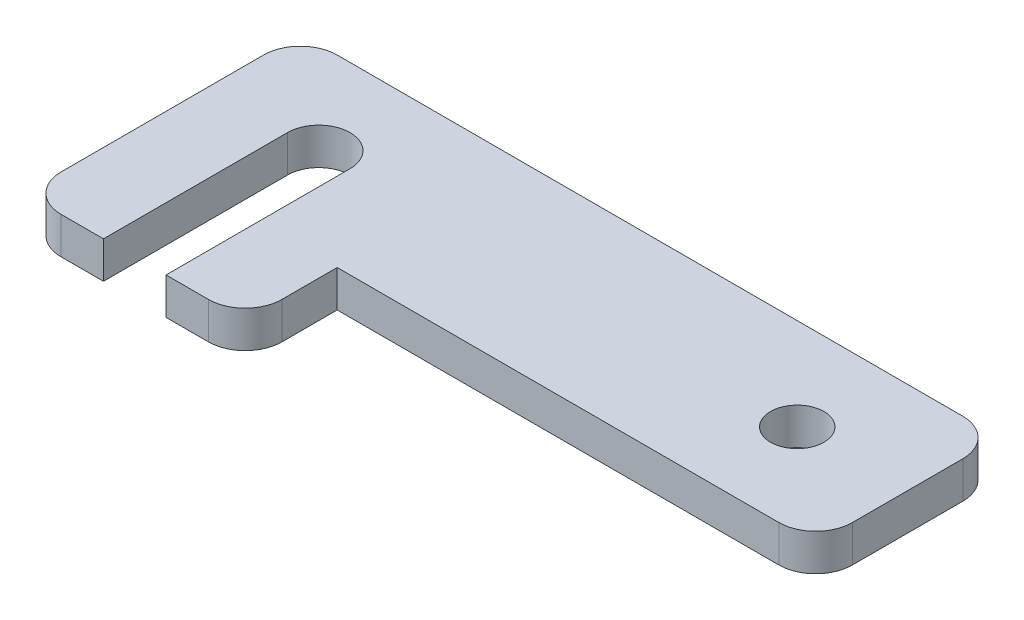
ISO-10303-21;
HEADER;
FILE_DESCRIPTION(('STEP AP214'),'2;1');
FILE_NAME('part.step','',(''),(''),'','','');
FILE_SCHEMA(('AUTOMOTIVE_DESIGN { 1 0 10303 214 1 1 1 1 }'));
ENDSEC;
DATA;
#1=APPLICATION_CONTEXT('core data for automotive mechanical design processes');
#2=APPLICATION_PROTOCOL_DEFINITION('international standard','automotive_design',2000,#1);
#3=PRODUCT_CONTEXT('',#1,'mechanical');
#4=PRODUCT('Part','Part','',(#3));
#5=PRODUCT_RELATED_PRODUCT_CATEGORY('part','',(#4));
#6=PRODUCT_DEFINITION_FORMATION('','',#4);
#7=PRODUCT_DEFINITION_CONTEXT('part definition',#1,'design');
#8=PRODUCT_DEFINITION('design','',#6,#7);
#9=PRODUCT_DEFINITION_SHAPE('','',#8);
#10=(LENGTH_UNIT() NAMED_UNIT(*) SI_UNIT(.MILLI.,.METRE.));
#11=(NAMED_UNIT(*) PLANE_ANGLE_UNIT() SI_UNIT($,.RADIAN.));
#12=(NAMED_UNIT(*) SI_UNIT($,.STERADIAN.) SOLID_ANGLE_UNIT());
#13=UNCERTAINTY_MEASURE_WITH_UNIT(LENGTH_MEASURE(1.E-05),#10,'distance_accuracy_value','');
#14=(GEOMETRIC_REPRESENTATION_CONTEXT(3) GLOBAL_UNCERTAINTY_ASSIGNED_CONTEXT((#13)) GLOBAL_UNIT_ASSIGNED_CONTEXT((#10,
#11,#12)) REPRESENTATION_CONTEXT('',''));
#15=CARTESIAN_POINT('',(0.,0.,0.));
#16=DIRECTION('',(0.,0.,1.));
#17=DIRECTION('',(1.,0.,0.));
#18=AXIS2_PLACEMENT_3D('',#15,#16,#17);
#19=CARTESIAN_POINT('',(0.,0.,15.));
#20=DIRECTION('',(0.,0.,-1.));
#21=DIRECTION('',(-1.,0.,0.));
#22=AXIS2_PLACEMENT_3D('',#19,#20,#21);
#23=PLANE('',#22);
#24=DIRECTION('',(1.,0.,0.));
#25=VECTOR('',#24,1.);
#26=CARTESIAN_POINT('',(-19.,-2.,15.));
#27=LINE('',#26,#25);
#28=CARTESIAN_POINT('',(-11.3,-2.,15.));
#29=VERTEX_POINT('',#28);
#30=CARTESIAN_POINT('',(-9.,-2.,15.));
#31=VERTEX_POINT('',#30);
#32=EDGE_CURVE('E202',#29,#31,#27,.T.);
#33=ORIENTED_EDGE('',*,*,#32,.T.);
#34=DIRECTION('',(0.,1.,0.));
#35=VECTOR('',#34,1.);
#36=CARTESIAN_POINT('',(-9.,0.,15.));
#37=LINE('',#36,#35);
#38=CARTESIAN_POINT('',(-9.,0.,15.));
#39=VERTEX_POINT('',#38);
#40=EDGE_CURVE('E47',#31,#39,#37,.T.);
#41=ORIENTED_EDGE('',*,*,#40,.T.);
#42=DIRECTION('',(1.,0.,0.));
#43=VECTOR('',#42,1.);
#44=CARTESIAN_POINT('',(-19.,0.,15.));
#45=LINE('',#44,#43);
#46=CARTESIAN_POINT('',(-11.3,0.,15.));
#47=VERTEX_POINT('',#46);
#48=EDGE_CURVE('E201',#47,#39,#45,.T.);
#49=ORIENTED_EDGE('',*,*,#48,.F.);
#50=DIRECTION('',(0.,1.,0.));
#51=VECTOR('',#50,1.);
#52=CARTESIAN_POINT('',(-11.3,-2.001,15.));
#53=LINE('',#52,#51);
#54=EDGE_CURVE('E272',#29,#47,#53,.T.);
#55=ORIENTED_EDGE('',*,*,#54,.F.);
#56=EDGE_LOOP('',(#33,#41,#49,#55));
#57=FACE_BOUND('',#56,.T.);
#58=ADVANCED_FACE('F39',(#57),#23,.F.);
#59=CARTESIAN_POINT('',(-19.,-2.,15.));
#60=DIRECTION('',(0.,1.,0.));
#61=DIRECTION('',(0.,0.,1.));
#62=AXIS2_PLACEMENT_3D('',#59,#60,#61);
#63=PLANE('',#62);
#64=CARTESIAN_POINT('',(13.,-2.,5.));
#65=DIRECTION('',(0.,1.,0.));
#66=DIRECTION('',(0.,0.,1.));
#67=AXIS2_PLACEMENT_3D('',#64,#65,#66);
#68=CIRCLE('',#67,1.44999999999999);
#69=CARTESIAN_POINT('',(13.,-2.,6.44999999999999));
#70=VERTEX_POINT('',#69);
#71=EDGE_CURVE('E184',#70,#70,#68,.T.);
#72=ORIENTED_EDGE('',*,*,#71,.T.);
#73=EDGE_LOOP('',(#72));
#74=FACE_BOUND('',#73,.T.);
#75=CARTESIAN_POINT('',(-17.,-2.,15.));
#76=VERTEX_POINT('',#75);
#77=CARTESIAN_POINT('',(-14.7,-2.,15.));
#78=VERTEX_POINT('',#77);
#79=EDGE_CURVE('E199',#76,#78,#27,.T.);
#80=ORIENTED_EDGE('',*,*,#79,.F.);
#81=CARTESIAN_POINT('',(-17.,-2.,13.));
#82=DIRECTION('',(0.,1.,0.));
#83=DIRECTION('',(0.,0.,1.));
#84=AXIS2_PLACEMENT_3D('',#81,#82,#83);
#85=CIRCLE('',#84,2.);
#86=CARTESIAN_POINT('',(-19.,-2.,13.));
#87=VERTEX_POINT('',#86);
#88=EDGE_CURVE('E245',#76,#87,#85,.F.);
#89=ORIENTED_EDGE('',*,*,#88,.T.);
#90=DIRECTION('',(0.,0.,-1.));
#91=VECTOR('',#90,1.);
#92=CARTESIAN_POINT('',(-19.,-2.,15.));
#93=LINE('',#92,#91);
#94=CARTESIAN_POINT('',(-19.,-2.,2.));
#95=VERTEX_POINT('',#94);
#96=EDGE_CURVE('E204',#87,#95,#93,.T.);
#97=ORIENTED_EDGE('',*,*,#96,.T.);
#98=CARTESIAN_POINT('',(-17.,-2.,2.));
#99=DIRECTION('',(0.,1.,0.));
#100=DIRECTION('',(0.,0.,1.));
#101=AXIS2_PLACEMENT_3D('',#98,#99,#100);
#102=CIRCLE('',#101,2.);
#103=CARTESIAN_POINT('',(-17.,-2.,0.));
#104=VERTEX_POINT('',#103);
#105=EDGE_CURVE('E243',#95,#104,#102,.F.);
#106=ORIENTED_EDGE('',*,*,#105,.T.);
#107=DIRECTION('',(1.,0.,0.));
#108=VECTOR('',#107,1.);
#109=CARTESIAN_POINT('',(-19.,-2.,0.));
#110=LINE('',#109,#108);
#111=CARTESIAN_POINT('',(17.,-2.,0.));
#112=VERTEX_POINT('',#111);
#113=EDGE_CURVE('E198',#104,#112,#110,.T.);
#114=ORIENTED_EDGE('',*,*,#113,.T.);
#115=CARTESIAN_POINT('',(17.,-2.,2.));
#116=DIRECTION('',(0.,1.,0.));
#117=DIRECTION('',(0.,0.,1.));
#118=AXIS2_PLACEMENT_3D('',#115,#116,#117);
#119=CIRCLE('',#118,2.);
#120=CARTESIAN_POINT('',(19.,-2.,2.));
#121=VERTEX_POINT('',#120);
#122=EDGE_CURVE('E241',#112,#121,#119,.F.);
#123=ORIENTED_EDGE('',*,*,#122,.T.);
#124=DIRECTION('',(0.,0.,-1.));
#125=VECTOR('',#124,1.);
#126=CARTESIAN_POINT('',(19.,-2.,15.));
#127=LINE('',#126,#125);
#128=CARTESIAN_POINT('',(19.,-2.,8.));
#129=VERTEX_POINT('',#128);
#130=EDGE_CURVE('E218',#129,#121,#127,.T.);
#131=ORIENTED_EDGE('',*,*,#130,.F.);
#132=CARTESIAN_POINT('',(17.,-2.,8.));
#133=DIRECTION('',(0.,1.,0.));
#134=DIRECTION('',(0.,0.,1.));
#135=AXIS2_PLACEMENT_3D('',#132,#133,#134);
#136=CIRCLE('',#135,2.);
#137=CARTESIAN_POINT('',(17.,-2.,10.));
#138=VERTEX_POINT('',#137);
#139=EDGE_CURVE('E60',#129,#138,#136,.F.);
#140=ORIENTED_EDGE('',*,*,#139,.T.);
#141=DIRECTION('',(1.,0.,0.));
#142=VECTOR('',#141,1.);
#143=CARTESIAN_POINT('',(19.,-2.,10.));
#144=LINE('',#143,#142);
#145=CARTESIAN_POINT('',(-7.,-2.,10.));
#146=VERTEX_POINT('',#145);
#147=EDGE_CURVE('E196',#146,#138,#144,.T.);
#148=ORIENTED_EDGE('',*,*,#147,.F.);
#149=DIRECTION('',(0.,0.,-1.));
#150=VECTOR('',#149,1.);
#151=CARTESIAN_POINT('',(-7.,-2.,15.));
#152=LINE('',#151,#150);
#153=CARTESIAN_POINT('',(-7.,-2.,13.));
#154=VERTEX_POINT('',#153);
#155=EDGE_CURVE('E187',#154,#146,#152,.T.);
#156=ORIENTED_EDGE('',*,*,#155,.F.);
#157=CARTESIAN_POINT('',(-9.,-2.,13.));
#158=DIRECTION('',(0.,1.,0.));
#159=DIRECTION('',(0.,0.,1.));
#160=AXIS2_PLACEMENT_3D('',#157,#158,#159);
#161=CIRCLE('',#160,2.);
#162=EDGE_CURVE('E238',#154,#31,#161,.F.);
#163=ORIENTED_EDGE('',*,*,#162,.T.);
#164=ORIENTED_EDGE('',*,*,#32,.F.);
#165=DIRECTION('',(0.,0.,1.));
#166=VECTOR('',#165,1.);
#167=CARTESIAN_POINT('',(-11.3,-2.,5.));
#168=LINE('',#167,#166);
#169=CARTESIAN_POINT('',(-11.3,-2.,5.));
#170=VERTEX_POINT('',#169);
#171=EDGE_CURVE('E168',#170,#29,#168,.T.);
#172=ORIENTED_EDGE('',*,*,#171,.F.);
#173=CARTESIAN_POINT('',(-13.,-2.,5.));
#174=DIRECTION('',(0.,1.,0.));
#175=DIRECTION('',(0.,0.,1.));
#176=AXIS2_PLACEMENT_3D('',#173,#174,#175);
#177=CIRCLE('',#176,1.7);
#178=CARTESIAN_POINT('',(-14.7,-2.,5.));
#179=VERTEX_POINT('',#178);
#180=EDGE_CURVE('E274',#179,#170,#177,.F.);
#181=ORIENTED_EDGE('',*,*,#180,.F.);
#182=DIRECTION('',(0.,0.,-1.));
#183=VECTOR('',#182,1.);
#184=CARTESIAN_POINT('',(-14.7,-2.,5.));
#185=LINE('',#184,#183);
#186=EDGE_CURVE('E155',#78,#179,#185,.T.);
#187=ORIENTED_EDGE('',*,*,#186,.F.);
#188=EDGE_LOOP('',(#80,#89,#97,#106,#114,#123,#131,#140,#148,#156,#163,#164,#172,#181,#187));
#189=FACE_BOUND('',#188,.T.);
#190=ADVANCED_FACE('F281',(#74,#189),#63,.F.);
#191=CARTESIAN_POINT('',(19.,0.,15.));
#192=DIRECTION('',(1.,0.,0.));
#193=DIRECTION('',(0.,0.,-1.));
#194=AXIS2_PLACEMENT_3D('',#191,#192,#193);
#195=PLANE('',#194);
#196=ORIENTED_EDGE('',*,*,#130,.T.);
#197=DIRECTION('',(0.,-1.,0.));
#198=VECTOR('',#197,1.);
#199=CARTESIAN_POINT('',(19.,0.,2.));
#200=LINE('',#199,#198);
#201=CARTESIAN_POINT('',(19.,0.,2.));
#202=VERTEX_POINT('',#201);
#203=EDGE_CURVE('E255',#121,#202,#200,.F.);
#204=ORIENTED_EDGE('',*,*,#203,.T.);
#205=DIRECTION('',(0.,0.,-1.));
#206=VECTOR('',#205,1.);
#207=CARTESIAN_POINT('',(19.,0.,15.));
#208=LINE('',#207,#206);
#209=CARTESIAN_POINT('',(19.,0.,8.));
#210=VERTEX_POINT('',#209);
#211=EDGE_CURVE('E215',#210,#202,#208,.T.);
#212=ORIENTED_EDGE('',*,*,#211,.F.);
#213=DIRECTION('',(0.,1.,0.));
#214=VECTOR('',#213,1.);
#215=CARTESIAN_POINT('',(19.,-2.,8.));
#216=LINE('',#215,#214);
#217=EDGE_CURVE('E253',#210,#129,#216,.F.);
#218=ORIENTED_EDGE('',*,*,#217,.T.);
#219=EDGE_LOOP('',(#196,#204,#212,#218));
#220=FACE_BOUND('',#219,.T.);
#221=ADVANCED_FACE('F296',(#220),#195,.T.);
#222=CARTESIAN_POINT('',(-19.,0.,15.));
#223=DIRECTION('',(0.,1.,0.));
#224=DIRECTION('',(0.,0.,1.));
#225=AXIS2_PLACEMENT_3D('',#222,#223,#224);
#226=PLANE('',#225);
#227=DIRECTION('',(0.,0.,-1.));
#228=VECTOR('',#227,1.);
#229=CARTESIAN_POINT('',(-19.,0.,15.));
#230=LINE('',#229,#228);
#231=CARTESIAN_POINT('',(-19.,0.,13.));
#232=VERTEX_POINT('',#231);
#233=CARTESIAN_POINT('',(-19.,0.,2.));
#234=VERTEX_POINT('',#233);
#235=EDGE_CURVE('E212',#232,#234,#230,.T.);
#236=ORIENTED_EDGE('',*,*,#235,.F.);
#237=CARTESIAN_POINT('',(-17.,0.,13.));
#238=DIRECTION('',(0.,1.,0.));
#239=DIRECTION('',(0.,0.,1.));
#240=AXIS2_PLACEMENT_3D('',#237,#238,#239);
#241=CIRCLE('',#240,2.);
#242=CARTESIAN_POINT('',(-17.,0.,15.));
#243=VERTEX_POINT('',#242);
#244=EDGE_CURVE('E234',#232,#243,#241,.T.);
#245=ORIENTED_EDGE('',*,*,#244,.T.);
#246=CARTESIAN_POINT('',(-14.7,0.,15.));
#247=VERTEX_POINT('',#246);
#248=EDGE_CURVE('E174',#243,#247,#45,.T.);
#249=ORIENTED_EDGE('',*,*,#248,.T.);
#250=DIRECTION('',(0.,0.,1.));
#251=VECTOR('',#250,1.);
#252=CARTESIAN_POINT('',(-14.7,0.,5.));
#253=LINE('',#252,#251);
#254=CARTESIAN_POINT('',(-14.7,0.,5.));
#255=VERTEX_POINT('',#254);
#256=EDGE_CURVE('E152',#255,#247,#253,.T.);
#257=ORIENTED_EDGE('',*,*,#256,.F.);
#258=CARTESIAN_POINT('',(-13.,0.,5.));
#259=DIRECTION('',(0.,1.,0.));
#260=DIRECTION('',(0.,0.,1.));
#261=AXIS2_PLACEMENT_3D('',#258,#259,#260);
#262=CIRCLE('',#261,1.7);
#263=CARTESIAN_POINT('',(-11.3,0.,5.));
#264=VERTEX_POINT('',#263);
#265=EDGE_CURVE('E163',#264,#255,#262,.T.);
#266=ORIENTED_EDGE('',*,*,#265,.F.);
#267=DIRECTION('',(0.,0.,-1.));
#268=VECTOR('',#267,1.);
#269=CARTESIAN_POINT('',(-11.3,0.,5.));
#270=LINE('',#269,#268);
#271=EDGE_CURVE('E160',#47,#264,#270,.T.);
#272=ORIENTED_EDGE('',*,*,#271,.F.);
#273=ORIENTED_EDGE('',*,*,#48,.T.);
#274=CARTESIAN_POINT('',(-9.,0.,13.));
#275=DIRECTION('',(0.,1.,0.));
#276=DIRECTION('',(0.,0.,1.));
#277=AXIS2_PLACEMENT_3D('',#274,#275,#276);
#278=CIRCLE('',#277,2.);
#279=CARTESIAN_POINT('',(-7.,0.,13.));
#280=VERTEX_POINT('',#279);
#281=EDGE_CURVE('E226',#39,#280,#278,.T.);
#282=ORIENTED_EDGE('',*,*,#281,.T.);
#283=DIRECTION('',(0.,0.,1.));
#284=VECTOR('',#283,1.);
#285=CARTESIAN_POINT('',(-7.,0.,15.));
#286=LINE('',#285,#284);
#287=CARTESIAN_POINT('',(-7.,0.,10.));
#288=VERTEX_POINT('',#287);
#289=EDGE_CURVE('E191',#288,#280,#286,.T.);
#290=ORIENTED_EDGE('',*,*,#289,.F.);
#291=DIRECTION('',(-1.,0.,0.));
#292=VECTOR('',#291,1.);
#293=CARTESIAN_POINT('',(19.,0.,10.));
#294=LINE('',#293,#292);
#295=CARTESIAN_POINT('',(17.,0.,10.));
#296=VERTEX_POINT('',#295);
#297=EDGE_CURVE('E189',#296,#288,#294,.T.);
#298=ORIENTED_EDGE('',*,*,#297,.F.);
#299=CARTESIAN_POINT('',(17.,0.,8.));
#300=DIRECTION('',(0.,1.,0.));
#301=DIRECTION('',(0.,0.,1.));
#302=AXIS2_PLACEMENT_3D('',#299,#300,#301);
#303=CIRCLE('',#302,2.);
#304=EDGE_CURVE('E228',#296,#210,#303,.T.);
#305=ORIENTED_EDGE('',*,*,#304,.T.);
#306=ORIENTED_EDGE('',*,*,#211,.T.);
#307=CARTESIAN_POINT('',(17.,0.,2.));
#308=DIRECTION('',(0.,1.,0.));
#309=DIRECTION('',(0.,0.,1.));
#310=AXIS2_PLACEMENT_3D('',#307,#308,#309);
#311=CIRCLE('',#310,2.);
#312=CARTESIAN_POINT('',(17.,0.,0.));
#313=VERTEX_POINT('',#312);
#314=EDGE_CURVE('E230',#202,#313,#311,.T.);
#315=ORIENTED_EDGE('',*,*,#314,.T.);
#316=DIRECTION('',(1.,0.,0.));
#317=VECTOR('',#316,1.);
#318=CARTESIAN_POINT('',(-19.,0.,0.));
#319=LINE('',#318,#317);
#320=CARTESIAN_POINT('',(-17.,0.,0.));
#321=VERTEX_POINT('',#320);
#322=EDGE_CURVE('E207',#321,#313,#319,.T.);
#323=ORIENTED_EDGE('',*,*,#322,.F.);
#324=CARTESIAN_POINT('',(-17.,0.,2.));
#325=DIRECTION('',(0.,1.,0.));
#326=DIRECTION('',(0.,0.,1.));
#327=AXIS2_PLACEMENT_3D('',#324,#325,#326);
#328=CIRCLE('',#327,2.);
#329=EDGE_CURVE('E232',#321,#234,#328,.T.);
#330=ORIENTED_EDGE('',*,*,#329,.T.);
#331=EDGE_LOOP('',(#236,#245,#249,#257,#266,#272,#273,#282,#290,#298,#305,#306,#315,#323,#330));
#332=FACE_BOUND('',#331,.T.);
#333=CARTESIAN_POINT('',(13.,0.,5.));
#334=DIRECTION('',(0.,1.,0.));
#335=DIRECTION('',(0.,0.,1.));
#336=AXIS2_PLACEMENT_3D('',#333,#334,#335);
#337=CIRCLE('',#336,1.44999999999999);
#338=CARTESIAN_POINT('',(13.,0.,6.44999999999999));
#339=VERTEX_POINT('',#338);
#340=EDGE_CURVE('E181',#339,#339,#337,.T.);
#341=ORIENTED_EDGE('',*,*,#340,.F.);
#342=EDGE_LOOP('',(#341));
#343=FACE_BOUND('',#342,.T.);
#344=ADVANCED_FACE('F171',(#332,#343),#226,.T.);
#345=CARTESIAN_POINT('',(-19.,-2.,15.));
#346=DIRECTION('',(-1.,0.,0.));
#347=DIRECTION('',(0.,0.,1.));
#348=AXIS2_PLACEMENT_3D('',#345,#346,#347);
#349=PLANE('',#348);
#350=ORIENTED_EDGE('',*,*,#96,.F.);
#351=DIRECTION('',(0.,1.,0.));
#352=VECTOR('',#351,1.);
#353=CARTESIAN_POINT('',(-19.,0.,13.));
#354=LINE('',#353,#352);
#355=EDGE_CURVE('E223',#87,#232,#354,.T.);
#356=ORIENTED_EDGE('',*,*,#355,.T.);
#357=ORIENTED_EDGE('',*,*,#235,.T.);
#358=DIRECTION('',(0.,1.,0.));
#359=VECTOR('',#358,1.);
#360=CARTESIAN_POINT('',(-19.,-2.,2.));
#361=LINE('',#360,#359);
#362=EDGE_CURVE('E221',#234,#95,#361,.F.);
#363=ORIENTED_EDGE('',*,*,#362,.T.);
#364=EDGE_LOOP('',(#350,#356,#357,#363));
#365=FACE_BOUND('',#364,.T.);
#366=ADVANCED_FACE('F303',(#365),#349,.T.);
#367=ORIENTED_EDGE('',*,*,#248,.F.);
#368=DIRECTION('',(0.,1.,0.));
#369=VECTOR('',#368,1.);
#370=CARTESIAN_POINT('',(-17.,-2.,15.));
#371=LINE('',#370,#369);
#372=EDGE_CURVE('E236',#243,#76,#371,.F.);
#373=ORIENTED_EDGE('',*,*,#372,.T.);
#374=ORIENTED_EDGE('',*,*,#79,.T.);
#375=DIRECTION('',(0.,-1.,0.));
#376=VECTOR('',#375,1.);
#377=CARTESIAN_POINT('',(-14.7,-2.001,15.));
#378=LINE('',#377,#376);
#379=EDGE_CURVE('E275',#247,#78,#378,.T.);
#380=ORIENTED_EDGE('',*,*,#379,.F.);
#381=EDGE_LOOP('',(#367,#373,#374,#380));
#382=FACE_BOUND('',#381,.T.);
#383=ADVANCED_FACE('F292',(#382),#23,.F.);
#384=CARTESIAN_POINT('',(0.,0.,0.));
#385=DIRECTION('',(0.,0.,-1.));
#386=DIRECTION('',(-1.,0.,0.));
#387=AXIS2_PLACEMENT_3D('',#384,#385,#386);
#388=PLANE('',#387);
#389=ORIENTED_EDGE('',*,*,#113,.F.);
#390=DIRECTION('',(0.,1.,0.));
#391=VECTOR('',#390,1.);
#392=CARTESIAN_POINT('',(-17.,0.,0.));
#393=LINE('',#392,#391);
#394=EDGE_CURVE('E250',#104,#321,#393,.T.);
#395=ORIENTED_EDGE('',*,*,#394,.T.);
#396=ORIENTED_EDGE('',*,*,#322,.T.);
#397=DIRECTION('',(0.,-1.,0.));
#398=VECTOR('',#397,1.);
#399=CARTESIAN_POINT('',(17.,0.,0.));
#400=LINE('',#399,#398);
#401=EDGE_CURVE('E247',#313,#112,#400,.T.);
#402=ORIENTED_EDGE('',*,*,#401,.T.);
#403=EDGE_LOOP('',(#389,#395,#396,#402));
#404=FACE_BOUND('',#403,.T.);
#405=ADVANCED_FACE('F302',(#404),#388,.T.);
#406=CARTESIAN_POINT('',(-7.,-2.001,15.));
#407=DIRECTION('',(-1.,0.,0.));
#408=DIRECTION('',(0.,0.,1.));
#409=AXIS2_PLACEMENT_3D('',#406,#407,#408);
#410=PLANE('',#409);
#411=ORIENTED_EDGE('',*,*,#289,.T.);
#412=DIRECTION('',(0.,1.,0.));
#413=VECTOR('',#412,1.);
#414=CARTESIAN_POINT('',(-7.,-2.001,13.));
#415=LINE('',#414,#413);
#416=EDGE_CURVE('E11',#280,#154,#415,.F.);
#417=ORIENTED_EDGE('',*,*,#416,.T.);
#418=ORIENTED_EDGE('',*,*,#155,.T.);
#419=DIRECTION('',(0.,1.,0.));
#420=VECTOR('',#419,1.);
#421=CARTESIAN_POINT('',(-7.,-2.001,10.));
#422=LINE('',#421,#420);
#423=EDGE_CURVE('E193',#146,#288,#422,.T.);
#424=ORIENTED_EDGE('',*,*,#423,.T.);
#425=EDGE_LOOP('',(#411,#417,#418,#424));
#426=FACE_BOUND('',#425,.T.);
#427=ADVANCED_FACE('F308',(#426),#410,.F.);
#428=CARTESIAN_POINT('',(19.,-2.001,10.));
#429=DIRECTION('',(0.,0.,-1.));
#430=DIRECTION('',(-1.,0.,0.));
#431=AXIS2_PLACEMENT_3D('',#428,#429,#430);
#432=PLANE('',#431);
#433=ORIENTED_EDGE('',*,*,#147,.T.);
#434=DIRECTION('',(0.,1.,0.));
#435=VECTOR('',#434,1.);
#436=CARTESIAN_POINT('',(17.,0.,10.));
#437=LINE('',#436,#435);
#438=EDGE_CURVE('E257',#138,#296,#437,.T.);
#439=ORIENTED_EDGE('',*,*,#438,.T.);
#440=ORIENTED_EDGE('',*,*,#297,.T.);
#441=ORIENTED_EDGE('',*,*,#423,.F.);
#442=EDGE_LOOP('',(#433,#439,#440,#441));
#443=FACE_BOUND('',#442,.T.);
#444=ADVANCED_FACE('F334',(#443),#432,.F.);
#445=CARTESIAN_POINT('',(13.,0.,5.));
#446=DIRECTION('',(0.,1.,0.));
#447=DIRECTION('',(0.,0.,1.));
#448=AXIS2_PLACEMENT_3D('',#445,#446,#447);
#449=CYLINDRICAL_SURFACE('',#448,1.44999999999999);
#450=ORIENTED_EDGE('',*,*,#71,.F.);
#451=EDGE_LOOP('',(#450));
#452=FACE_BOUND('',#451,.T.);
#453=ORIENTED_EDGE('',*,*,#340,.T.);
#454=EDGE_LOOP('',(#453));
#455=FACE_BOUND('',#454,.T.);
#456=ADVANCED_FACE('F341',(#452,#455),#449,.F.);
#457=CARTESIAN_POINT('',(-13.,-2.001,5.));
#458=DIRECTION('',(0.,1.,0.));
#459=DIRECTION('',(0.,0.,1.));
#460=AXIS2_PLACEMENT_3D('',#457,#458,#459);
#461=CYLINDRICAL_SURFACE('',#460,1.7);
#462=ORIENTED_EDGE('',*,*,#180,.T.);
#463=DIRECTION('',(0.,1.,0.));
#464=VECTOR('',#463,1.);
#465=CARTESIAN_POINT('',(-11.3,-2.001,5.));
#466=LINE('',#465,#464);
#467=EDGE_CURVE('E159',#170,#264,#466,.T.);
#468=ORIENTED_EDGE('',*,*,#467,.T.);
#469=ORIENTED_EDGE('',*,*,#265,.T.);
#470=DIRECTION('',(0.,1.,0.));
#471=VECTOR('',#470,1.);
#472=CARTESIAN_POINT('',(-14.7,-2.001,5.));
#473=LINE('',#472,#471);
#474=EDGE_CURVE('E147',#179,#255,#473,.T.);
#475=ORIENTED_EDGE('',*,*,#474,.F.);
#476=EDGE_LOOP('',(#462,#468,#469,#475));
#477=FACE_BOUND('',#476,.T.);
#478=ADVANCED_FACE('F164',(#477),#461,.F.);
#479=CARTESIAN_POINT('',(-11.3,-2.001,5.));
#480=DIRECTION('',(1.,0.,0.));
#481=DIRECTION('',(0.,0.,-1.));
#482=AXIS2_PLACEMENT_3D('',#479,#480,#481);
#483=PLANE('',#482);
#484=ORIENTED_EDGE('',*,*,#171,.T.);
#485=ORIENTED_EDGE('',*,*,#54,.T.);
#486=ORIENTED_EDGE('',*,*,#271,.T.);
#487=ORIENTED_EDGE('',*,*,#467,.F.);
#488=EDGE_LOOP('',(#484,#485,#486,#487));
#489=FACE_BOUND('',#488,.T.);
#490=ADVANCED_FACE('F271',(#489),#483,.F.);
#491=CARTESIAN_POINT('',(-14.7,-2.001,5.));
#492=DIRECTION('',(-1.,0.,0.));
#493=DIRECTION('',(0.,0.,1.));
#494=AXIS2_PLACEMENT_3D('',#491,#492,#493);
#495=PLANE('',#494);
#496=ORIENTED_EDGE('',*,*,#186,.T.);
#497=ORIENTED_EDGE('',*,*,#474,.T.);
#498=ORIENTED_EDGE('',*,*,#256,.T.);
#499=ORIENTED_EDGE('',*,*,#379,.T.);
#500=EDGE_LOOP('',(#496,#497,#498,#499));
#501=FACE_BOUND('',#500,.T.);
#502=ADVANCED_FACE('F149',(#501),#495,.F.);
#503=CARTESIAN_POINT('',(-17.,-2.,13.));
#504=DIRECTION('',(0.,-1.,0.));
#505=DIRECTION('',(0.,0.,-1.));
#506=AXIS2_PLACEMENT_3D('',#503,#504,#505);
#507=CYLINDRICAL_SURFACE('',#506,2.);
#508=ORIENTED_EDGE('',*,*,#88,.F.);
#509=ORIENTED_EDGE('',*,*,#372,.F.);
#510=ORIENTED_EDGE('',*,*,#244,.F.);
#511=ORIENTED_EDGE('',*,*,#355,.F.);
#512=EDGE_LOOP('',(#508,#509,#510,#511));
#513=FACE_BOUND('',#512,.T.);
#514=ADVANCED_FACE('F314',(#513),#507,.T.);
#515=CARTESIAN_POINT('',(-17.,0.,2.));
#516=DIRECTION('',(0.,1.,0.));
#517=DIRECTION('',(0.,0.,1.));
#518=AXIS2_PLACEMENT_3D('',#515,#516,#517);
#519=CYLINDRICAL_SURFACE('',#518,2.);
#520=ORIENTED_EDGE('',*,*,#105,.F.);
#521=ORIENTED_EDGE('',*,*,#362,.F.);
#522=ORIENTED_EDGE('',*,*,#329,.F.);
#523=ORIENTED_EDGE('',*,*,#394,.F.);
#524=EDGE_LOOP('',(#520,#521,#522,#523));
#525=FACE_BOUND('',#524,.T.);
#526=ADVANCED_FACE('F320',(#525),#519,.T.);
#527=CARTESIAN_POINT('',(17.,0.,2.));
#528=DIRECTION('',(0.,-1.,0.));
#529=DIRECTION('',(0.,0.,-1.));
#530=AXIS2_PLACEMENT_3D('',#527,#528,#529);
#531=CYLINDRICAL_SURFACE('',#530,2.);
#532=ORIENTED_EDGE('',*,*,#314,.F.);
#533=ORIENTED_EDGE('',*,*,#203,.F.);
#534=ORIENTED_EDGE('',*,*,#122,.F.);
#535=ORIENTED_EDGE('',*,*,#401,.F.);
#536=EDGE_LOOP('',(#532,#533,#534,#535));
#537=FACE_BOUND('',#536,.T.);
#538=ADVANCED_FACE('F288',(#537),#531,.T.);
#539=CARTESIAN_POINT('',(17.,-2.001,8.));
#540=DIRECTION('',(0.,-1.,0.));
#541=DIRECTION('',(0.,0.,-1.));
#542=AXIS2_PLACEMENT_3D('',#539,#540,#541);
#543=CYLINDRICAL_SURFACE('',#542,2.);
#544=ORIENTED_EDGE('',*,*,#139,.F.);
#545=ORIENTED_EDGE('',*,*,#217,.F.);
#546=ORIENTED_EDGE('',*,*,#304,.F.);
#547=ORIENTED_EDGE('',*,*,#438,.F.);
#548=EDGE_LOOP('',(#544,#545,#546,#547));
#549=FACE_BOUND('',#548,.T.);
#550=ADVANCED_FACE('F284',(#549),#543,.T.);
#551=CARTESIAN_POINT('',(-9.,0.,13.));
#552=DIRECTION('',(0.,1.,0.));
#553=DIRECTION('',(0.,0.,1.));
#554=AXIS2_PLACEMENT_3D('',#551,#552,#553);
#555=CYLINDRICAL_SURFACE('',#554,2.);
#556=ORIENTED_EDGE('',*,*,#162,.F.);
#557=ORIENTED_EDGE('',*,*,#416,.F.);
#558=ORIENTED_EDGE('',*,*,#281,.F.);
#559=ORIENTED_EDGE('',*,*,#40,.F.);
#560=EDGE_LOOP('',(#556,#557,#558,#559));
#561=FACE_BOUND('',#560,.T.);
#562=ADVANCED_FACE('F41',(#561),#555,.T.);
#563=CLOSED_SHELL('',(#58,#190,#221,#344,#366,#383,#405,#427,#444,#456,#478,#490,#502,#514,#526,
#538,#550,#562));
#564=MANIFOLD_SOLID_BREP('B2',#563);
#565=ADVANCED_BREP_SHAPE_REPRESENTATION('',(#18,#564),#14);
#566=SHAPE_DEFINITION_REPRESENTATION(#9,#565);
ENDSEC;
END-ISO-10303-21;
